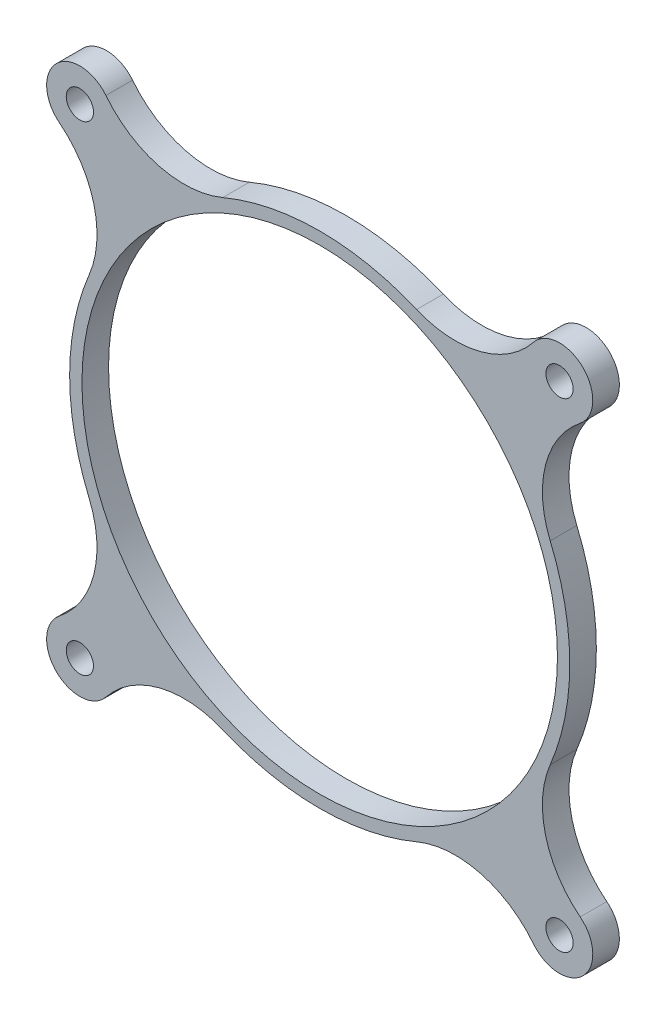
ISO-10303-21;
HEADER;
FILE_DESCRIPTION(('STEP AP214'),'2;1');
FILE_NAME('part.step','',(''),(''),'','','');
FILE_SCHEMA(('AUTOMOTIVE_DESIGN { 1 0 10303 214 1 1 1 1 }'));
ENDSEC;
DATA;
#1=APPLICATION_CONTEXT('core data for automotive mechanical design processes');
#2=APPLICATION_PROTOCOL_DEFINITION('international standard','automotive_design',2000,#1);
#3=PRODUCT_CONTEXT('',#1,'mechanical');
#4=PRODUCT('Part','Part','',(#3));
#5=PRODUCT_RELATED_PRODUCT_CATEGORY('part','',(#4));
#6=PRODUCT_DEFINITION_FORMATION('','',#4);
#7=PRODUCT_DEFINITION_CONTEXT('part definition',#1,'design');
#8=PRODUCT_DEFINITION('design','',#6,#7);
#9=PRODUCT_DEFINITION_SHAPE('','',#8);
#10=(LENGTH_UNIT() NAMED_UNIT(*) SI_UNIT(.MILLI.,.METRE.));
#11=(NAMED_UNIT(*) PLANE_ANGLE_UNIT() SI_UNIT($,.RADIAN.));
#12=(NAMED_UNIT(*) SI_UNIT($,.STERADIAN.) SOLID_ANGLE_UNIT());
#13=UNCERTAINTY_MEASURE_WITH_UNIT(LENGTH_MEASURE(1.E-05),#10,'distance_accuracy_value','');
#14=(GEOMETRIC_REPRESENTATION_CONTEXT(3) GLOBAL_UNCERTAINTY_ASSIGNED_CONTEXT((#13)) GLOBAL_UNIT_ASSIGNED_CONTEXT((#10,
#11,#12)) REPRESENTATION_CONTEXT('',''));
#15=CARTESIAN_POINT('',(0.,0.,0.));
#16=DIRECTION('',(0.,0.,1.));
#17=DIRECTION('',(1.,0.,0.));
#18=AXIS2_PLACEMENT_3D('',#15,#16,#17);
#19=CARTESIAN_POINT('',(-10.1949988567899,-24.2435970579873,4.));
#20=DIRECTION('',(0.,0.,-1.));
#21=DIRECTION('',(-1.,0.,0.));
#22=AXIS2_PLACEMENT_3D('',#19,#20,#21);
#23=PLANE('',#22);
#24=CARTESIAN_POINT('',(36.0624458405139,-36.062445840514,4.));
#25=DIRECTION('',(0.,0.,1.));
#26=DIRECTION('',(-1.,0.,0.));
#27=AXIS2_PLACEMENT_3D('',#24,#25,#26);
#28=CIRCLE('',#27,2.05);
#29=CARTESIAN_POINT('',(34.0124458405138,-36.062445840514,4.));
#30=VERTEX_POINT('',#29);
#31=EDGE_CURVE('E353',#30,#30,#28,.T.);
#32=ORIENTED_EDGE('',*,*,#31,.F.);
#33=EDGE_LOOP('',(#32));
#34=FACE_BOUND('',#33,.T.);
#35=CARTESIAN_POINT('',(36.0624458405138,36.062445840514,4.));
#36=DIRECTION('',(0.,0.,1.));
#37=DIRECTION('',(1.,0.,0.));
#38=AXIS2_PLACEMENT_3D('',#35,#36,#37);
#39=CIRCLE('',#38,2.05);
#40=CARTESIAN_POINT('',(38.1124458405138,36.062445840514,4.));
#41=VERTEX_POINT('',#40);
#42=EDGE_CURVE('E359',#41,#41,#39,.T.);
#43=ORIENTED_EDGE('',*,*,#42,.F.);
#44=EDGE_LOOP('',(#43));
#45=FACE_BOUND('',#44,.T.);
#46=CARTESIAN_POINT('',(-36.0624458405138,36.062445840514,4.));
#47=DIRECTION('',(0.,0.,1.));
#48=DIRECTION('',(-1.,0.,0.));
#49=AXIS2_PLACEMENT_3D('',#46,#47,#48);
#50=CIRCLE('',#49,2.05);
#51=CARTESIAN_POINT('',(-38.1124458405138,36.062445840514,4.));
#52=VERTEX_POINT('',#51);
#53=EDGE_CURVE('E365',#52,#52,#50,.T.);
#54=ORIENTED_EDGE('',*,*,#53,.F.);
#55=EDGE_LOOP('',(#54));
#56=FACE_BOUND('',#55,.T.);
#57=CARTESIAN_POINT('',(-36.0624458405139,-36.062445840514,4.));
#58=DIRECTION('',(0.,0.,1.));
#59=DIRECTION('',(1.,0.,0.));
#60=AXIS2_PLACEMENT_3D('',#57,#58,#59);
#61=CIRCLE('',#60,2.05);
#62=CARTESIAN_POINT('',(-34.0124458405138,-36.062445840514,4.));
#63=VERTEX_POINT('',#62);
#64=EDGE_CURVE('E189',#63,#63,#61,.T.);
#65=ORIENTED_EDGE('',*,*,#64,.F.);
#66=EDGE_LOOP('',(#65));
#67=FACE_BOUND('',#66,.T.);
#68=CARTESIAN_POINT('',(-20.3899977135799,-48.4871941159747,4.));
#69=DIRECTION('',(0.,0.,-1.));
#70=DIRECTION('',(-1.,0.,0.));
#71=AXIS2_PLACEMENT_3D('',#68,#69,#70);
#72=CIRCLE('',#71,15.);
#73=CARTESIAN_POINT('',(-32.1443338087804,-39.1686329093791,4.));
#74=VERTEX_POINT('',#73);
#75=CARTESIAN_POINT('',(-14.5753595823309,-34.6600475049553,4.));
#76=VERTEX_POINT('',#75);
#77=EDGE_CURVE('E216',#74,#76,#72,.T.);
#78=ORIENTED_EDGE('',*,*,#77,.T.);
#79=CARTESIAN_POINT('',(0.,0.,4.));
#80=DIRECTION('',(0.,0.,1.));
#81=DIRECTION('',(1.,0.,0.));
#82=AXIS2_PLACEMENT_3D('',#79,#80,#81);
#83=CIRCLE('',#82,37.6);
#84=CARTESIAN_POINT('',(14.5753595823308,-34.6600475049553,4.));
#85=VERTEX_POINT('',#84);
#86=EDGE_CURVE('E124',#76,#85,#83,.T.);
#87=ORIENTED_EDGE('',*,*,#86,.T.);
#88=CARTESIAN_POINT('',(20.3899977135799,-48.4871941159747,4.));
#89=DIRECTION('',(0.,0.,-1.));
#90=DIRECTION('',(1.,0.,0.));
#91=AXIS2_PLACEMENT_3D('',#88,#89,#90);
#92=CIRCLE('',#91,15.);
#93=CARTESIAN_POINT('',(32.1443338087804,-39.1686329093791,4.));
#94=VERTEX_POINT('',#93);
#95=EDGE_CURVE('E256',#85,#94,#92,.T.);
#96=ORIENTED_EDGE('',*,*,#95,.T.);
#97=CARTESIAN_POINT('',(36.0624458405139,-36.062445840514,4.));
#98=DIRECTION('',(0.,0.,1.));
#99=DIRECTION('',(-1.,0.,0.));
#100=AXIS2_PLACEMENT_3D('',#97,#98,#99);
#101=CIRCLE('',#100,4.99999999999999);
#102=CARTESIAN_POINT('',(39.168632909379,-32.1443338087805,4.));
#103=VERTEX_POINT('',#102);
#104=EDGE_CURVE('E275',#94,#103,#101,.T.);
#105=ORIENTED_EDGE('',*,*,#104,.T.);
#106=CARTESIAN_POINT('',(48.4871941159746,-20.38999771358,4.));
#107=DIRECTION('',(0.,0.,-1.));
#108=DIRECTION('',(-1.,0.,0.));
#109=AXIS2_PLACEMENT_3D('',#106,#107,#108);
#110=CIRCLE('',#109,15.);
#111=CARTESIAN_POINT('',(34.6600475049552,-14.575359582331,4.));
#112=VERTEX_POINT('',#111);
#113=EDGE_CURVE('E272',#103,#112,#110,.T.);
#114=ORIENTED_EDGE('',*,*,#113,.T.);
#115=CARTESIAN_POINT('',(0.,0.,4.));
#116=DIRECTION('',(0.,0.,1.));
#117=DIRECTION('',(1.,0.,0.));
#118=AXIS2_PLACEMENT_3D('',#115,#116,#117);
#119=CIRCLE('',#118,37.6);
#120=CARTESIAN_POINT('',(34.6600475049552,14.575359582331,4.));
#121=VERTEX_POINT('',#120);
#122=EDGE_CURVE('E274',#112,#121,#119,.T.);
#123=ORIENTED_EDGE('',*,*,#122,.T.);
#124=CARTESIAN_POINT('',(48.4871941159745,20.38999771358,4.));
#125=DIRECTION('',(0.,0.,-1.));
#126=DIRECTION('',(1.,0.,0.));
#127=AXIS2_PLACEMENT_3D('',#124,#125,#126);
#128=CIRCLE('',#127,15.);
#129=CARTESIAN_POINT('',(39.168632909379,32.1443338087805,4.));
#130=VERTEX_POINT('',#129);
#131=EDGE_CURVE('E277',#121,#130,#128,.T.);
#132=ORIENTED_EDGE('',*,*,#131,.T.);
#133=CARTESIAN_POINT('',(36.0624458405138,36.062445840514,4.));
#134=DIRECTION('',(0.,0.,1.));
#135=DIRECTION('',(1.,0.,0.));
#136=AXIS2_PLACEMENT_3D('',#133,#134,#135);
#137=CIRCLE('',#136,4.99999999999999);
#138=CARTESIAN_POINT('',(32.1443338087803,39.1686329093791,4.));
#139=VERTEX_POINT('',#138);
#140=EDGE_CURVE('E283',#130,#139,#137,.T.);
#141=ORIENTED_EDGE('',*,*,#140,.T.);
#142=CARTESIAN_POINT('',(20.3899977135798,48.4871941159747,4.));
#143=DIRECTION('',(0.,0.,-1.));
#144=DIRECTION('',(-1.,0.,0.));
#145=AXIS2_PLACEMENT_3D('',#142,#143,#144);
#146=CIRCLE('',#145,15.);
#147=CARTESIAN_POINT('',(14.5753595823308,34.6600475049553,4.));
#148=VERTEX_POINT('',#147);
#149=EDGE_CURVE('E285',#139,#148,#146,.T.);
#150=ORIENTED_EDGE('',*,*,#149,.T.);
#151=CARTESIAN_POINT('',(0.,0.,4.));
#152=DIRECTION('',(0.,0.,1.));
#153=DIRECTION('',(1.,0.,0.));
#154=AXIS2_PLACEMENT_3D('',#151,#152,#153);
#155=CIRCLE('',#154,37.6);
#156=CARTESIAN_POINT('',(-14.5753595823309,34.6600475049553,4.));
#157=VERTEX_POINT('',#156);
#158=EDGE_CURVE('E287',#148,#157,#155,.T.);
#159=ORIENTED_EDGE('',*,*,#158,.T.);
#160=CARTESIAN_POINT('',(-20.3899977135798,48.4871941159747,4.));
#161=DIRECTION('',(0.,0.,-1.));
#162=DIRECTION('',(1.,0.,0.));
#163=AXIS2_PLACEMENT_3D('',#160,#161,#162);
#164=CIRCLE('',#163,15.);
#165=CARTESIAN_POINT('',(-32.1443338087803,39.1686329093791,4.));
#166=VERTEX_POINT('',#165);
#167=EDGE_CURVE('E289',#157,#166,#164,.T.);
#168=ORIENTED_EDGE('',*,*,#167,.T.);
#169=CARTESIAN_POINT('',(-36.0624458405138,36.062445840514,4.));
#170=DIRECTION('',(0.,0.,1.));
#171=DIRECTION('',(-1.,0.,0.));
#172=AXIS2_PLACEMENT_3D('',#169,#170,#171);
#173=CIRCLE('',#172,4.99999999999999);
#174=CARTESIAN_POINT('',(-39.168632909379,32.1443338087805,4.));
#175=VERTEX_POINT('',#174);
#176=EDGE_CURVE('E291',#166,#175,#173,.T.);
#177=ORIENTED_EDGE('',*,*,#176,.T.);
#178=CARTESIAN_POINT('',(-48.4871941159745,20.38999771358,4.));
#179=DIRECTION('',(0.,0.,-1.));
#180=DIRECTION('',(-1.,0.,0.));
#181=AXIS2_PLACEMENT_3D('',#178,#179,#180);
#182=CIRCLE('',#181,15.);
#183=CARTESIAN_POINT('',(-34.6600475049552,14.575359582331,4.));
#184=VERTEX_POINT('',#183);
#185=EDGE_CURVE('E167',#175,#184,#182,.T.);
#186=ORIENTED_EDGE('',*,*,#185,.T.);
#187=CARTESIAN_POINT('',(0.,0.,4.));
#188=DIRECTION('',(0.,0.,1.));
#189=DIRECTION('',(1.,0.,0.));
#190=AXIS2_PLACEMENT_3D('',#187,#188,#189);
#191=CIRCLE('',#190,37.6);
#192=CARTESIAN_POINT('',(-34.6600475049552,-14.575359582331,4.));
#193=VERTEX_POINT('',#192);
#194=EDGE_CURVE('E161',#184,#193,#191,.T.);
#195=ORIENTED_EDGE('',*,*,#194,.T.);
#196=CARTESIAN_POINT('',(-48.4871941159746,-20.38999771358,4.));
#197=DIRECTION('',(0.,0.,-1.));
#198=DIRECTION('',(1.,0.,0.));
#199=AXIS2_PLACEMENT_3D('',#196,#197,#198);
#200=CIRCLE('',#199,15.);
#201=CARTESIAN_POINT('',(-39.168632909379,-32.1443338087805,4.));
#202=VERTEX_POINT('',#201);
#203=EDGE_CURVE('E165',#193,#202,#200,.T.);
#204=ORIENTED_EDGE('',*,*,#203,.T.);
#205=CARTESIAN_POINT('',(-36.0624458405139,-36.062445840514,4.));
#206=DIRECTION('',(0.,0.,1.));
#207=DIRECTION('',(1.,0.,0.));
#208=AXIS2_PLACEMENT_3D('',#205,#206,#207);
#209=CIRCLE('',#208,4.99999999999999);
#210=EDGE_CURVE('E57',#202,#74,#209,.T.);
#211=ORIENTED_EDGE('',*,*,#210,.T.);
#212=EDGE_LOOP('',(#78,#87,#96,#105,#114,#123,#132,#141,#150,#159,#168,#177,#186,#195,#204,#211));
#213=FACE_BOUND('',#212,.T.);
#214=CARTESIAN_POINT('',(0.,0.,4.));
#215=DIRECTION('',(0.,0.,-1.));
#216=DIRECTION('',(-1.,0.,0.));
#217=AXIS2_PLACEMENT_3D('',#214,#215,#216);
#218=CIRCLE('',#217,35.75);
#219=CARTESIAN_POINT('',(-35.75,0.,4.));
#220=VERTEX_POINT('',#219);
#221=EDGE_CURVE('E349',#220,#220,#218,.T.);
#222=ORIENTED_EDGE('',*,*,#221,.T.);
#223=EDGE_LOOP('',(#222));
#224=FACE_BOUND('',#223,.T.);
#225=ADVANCED_FACE('F39',(#34,#45,#56,#67,#213,#224),#23,.F.);
#226=CARTESIAN_POINT('',(-10.1949988567899,-24.2435970579873,0.));
#227=DIRECTION('',(0.,0.,-1.));
#228=DIRECTION('',(-1.,0.,0.));
#229=AXIS2_PLACEMENT_3D('',#226,#227,#228);
#230=PLANE('',#229);
#231=CARTESIAN_POINT('',(36.0624458405139,-36.062445840514,0.));
#232=DIRECTION('',(0.,0.,1.));
#233=DIRECTION('',(-1.,0.,0.));
#234=AXIS2_PLACEMENT_3D('',#231,#232,#233);
#235=CIRCLE('',#234,2.05);
#236=CARTESIAN_POINT('',(34.0124458405138,-36.062445840514,0.));
#237=VERTEX_POINT('',#236);
#238=EDGE_CURVE('E351',#237,#237,#235,.T.);
#239=ORIENTED_EDGE('',*,*,#238,.T.);
#240=EDGE_LOOP('',(#239));
#241=FACE_BOUND('',#240,.T.);
#242=CARTESIAN_POINT('',(-36.0624458405138,36.062445840514,0.));
#243=DIRECTION('',(0.,0.,1.));
#244=DIRECTION('',(-1.,0.,0.));
#245=AXIS2_PLACEMENT_3D('',#242,#243,#244);
#246=CIRCLE('',#245,2.05);
#247=CARTESIAN_POINT('',(-38.1124458405138,36.062445840514,0.));
#248=VERTEX_POINT('',#247);
#249=EDGE_CURVE('E362',#248,#248,#246,.T.);
#250=ORIENTED_EDGE('',*,*,#249,.T.);
#251=EDGE_LOOP('',(#250));
#252=FACE_BOUND('',#251,.T.);
#253=CARTESIAN_POINT('',(-36.0624458405139,-36.062445840514,0.));
#254=DIRECTION('',(0.,0.,1.));
#255=DIRECTION('',(1.,0.,0.));
#256=AXIS2_PLACEMENT_3D('',#253,#254,#255);
#257=CIRCLE('',#256,2.05);
#258=CARTESIAN_POINT('',(-34.0124458405138,-36.062445840514,0.));
#259=VERTEX_POINT('',#258);
#260=EDGE_CURVE('E368',#259,#259,#257,.T.);
#261=ORIENTED_EDGE('',*,*,#260,.T.);
#262=EDGE_LOOP('',(#261));
#263=FACE_BOUND('',#262,.T.);
#264=CARTESIAN_POINT('',(-20.3899977135799,-48.4871941159747,0.));
#265=DIRECTION('',(0.,0.,-1.));
#266=DIRECTION('',(-1.,0.,0.));
#267=AXIS2_PLACEMENT_3D('',#264,#265,#266);
#268=CIRCLE('',#267,15.);
#269=CARTESIAN_POINT('',(-32.1443338087804,-39.1686329093791,0.));
#270=VERTEX_POINT('',#269);
#271=CARTESIAN_POINT('',(-14.5753595823309,-34.6600475049553,0.));
#272=VERTEX_POINT('',#271);
#273=EDGE_CURVE('E185',#270,#272,#268,.T.);
#274=ORIENTED_EDGE('',*,*,#273,.F.);
#275=CARTESIAN_POINT('',(-36.0624458405139,-36.062445840514,0.));
#276=DIRECTION('',(0.,0.,1.));
#277=DIRECTION('',(1.,0.,0.));
#278=AXIS2_PLACEMENT_3D('',#275,#276,#277);
#279=CIRCLE('',#278,4.99999999999999);
#280=CARTESIAN_POINT('',(-39.168632909379,-32.1443338087805,0.));
#281=VERTEX_POINT('',#280);
#282=EDGE_CURVE('E116',#281,#270,#279,.T.);
#283=ORIENTED_EDGE('',*,*,#282,.F.);
#284=CARTESIAN_POINT('',(-48.4871941159746,-20.38999771358,0.));
#285=DIRECTION('',(0.,0.,-1.));
#286=DIRECTION('',(1.,0.,0.));
#287=AXIS2_PLACEMENT_3D('',#284,#285,#286);
#288=CIRCLE('',#287,15.);
#289=CARTESIAN_POINT('',(-34.6600475049552,-14.575359582331,0.));
#290=VERTEX_POINT('',#289);
#291=EDGE_CURVE('E110',#290,#281,#288,.T.);
#292=ORIENTED_EDGE('',*,*,#291,.F.);
#293=CARTESIAN_POINT('',(0.,0.,0.));
#294=DIRECTION('',(0.,0.,1.));
#295=DIRECTION('',(1.,0.,0.));
#296=AXIS2_PLACEMENT_3D('',#293,#294,#295);
#297=CIRCLE('',#296,37.6);
#298=CARTESIAN_POINT('',(-34.6600475049552,14.575359582331,0.));
#299=VERTEX_POINT('',#298);
#300=EDGE_CURVE('E175',#299,#290,#297,.T.);
#301=ORIENTED_EDGE('',*,*,#300,.F.);
#302=CARTESIAN_POINT('',(-48.4871941159745,20.38999771358,0.));
#303=DIRECTION('',(0.,0.,-1.));
#304=DIRECTION('',(-1.,0.,0.));
#305=AXIS2_PLACEMENT_3D('',#302,#303,#304);
#306=CIRCLE('',#305,15.);
#307=CARTESIAN_POINT('',(-39.168632909379,32.1443338087805,0.));
#308=VERTEX_POINT('',#307);
#309=EDGE_CURVE('E211',#308,#299,#306,.T.);
#310=ORIENTED_EDGE('',*,*,#309,.F.);
#311=CARTESIAN_POINT('',(-36.0624458405138,36.062445840514,0.));
#312=DIRECTION('',(0.,0.,1.));
#313=DIRECTION('',(-1.,0.,0.));
#314=AXIS2_PLACEMENT_3D('',#311,#312,#313);
#315=CIRCLE('',#314,4.99999999999999);
#316=CARTESIAN_POINT('',(-32.1443338087803,39.1686329093791,0.));
#317=VERTEX_POINT('',#316);
#318=EDGE_CURVE('E209',#317,#308,#315,.T.);
#319=ORIENTED_EDGE('',*,*,#318,.F.);
#320=CARTESIAN_POINT('',(-20.3899977135798,48.4871941159747,0.));
#321=DIRECTION('',(0.,0.,-1.));
#322=DIRECTION('',(1.,0.,0.));
#323=AXIS2_PLACEMENT_3D('',#320,#321,#322);
#324=CIRCLE('',#323,15.);
#325=CARTESIAN_POINT('',(-14.5753595823309,34.6600475049553,0.));
#326=VERTEX_POINT('',#325);
#327=EDGE_CURVE('E207',#326,#317,#324,.T.);
#328=ORIENTED_EDGE('',*,*,#327,.F.);
#329=CARTESIAN_POINT('',(0.,0.,0.));
#330=DIRECTION('',(0.,0.,1.));
#331=DIRECTION('',(1.,0.,0.));
#332=AXIS2_PLACEMENT_3D('',#329,#330,#331);
#333=CIRCLE('',#332,37.6);
#334=CARTESIAN_POINT('',(14.5753595823308,34.6600475049553,0.));
#335=VERTEX_POINT('',#334);
#336=EDGE_CURVE('E205',#335,#326,#333,.T.);
#337=ORIENTED_EDGE('',*,*,#336,.F.);
#338=CARTESIAN_POINT('',(20.3899977135798,48.4871941159747,0.));
#339=DIRECTION('',(0.,0.,-1.));
#340=DIRECTION('',(-1.,0.,0.));
#341=AXIS2_PLACEMENT_3D('',#338,#339,#340);
#342=CIRCLE('',#341,15.);
#343=CARTESIAN_POINT('',(32.1443338087803,39.1686329093791,0.));
#344=VERTEX_POINT('',#343);
#345=EDGE_CURVE('E203',#344,#335,#342,.T.);
#346=ORIENTED_EDGE('',*,*,#345,.F.);
#347=CARTESIAN_POINT('',(36.0624458405138,36.062445840514,0.));
#348=DIRECTION('',(0.,0.,1.));
#349=DIRECTION('',(1.,0.,0.));
#350=AXIS2_PLACEMENT_3D('',#347,#348,#349);
#351=CIRCLE('',#350,4.99999999999999);
#352=CARTESIAN_POINT('',(39.168632909379,32.1443338087805,0.));
#353=VERTEX_POINT('',#352);
#354=EDGE_CURVE('E201',#353,#344,#351,.T.);
#355=ORIENTED_EDGE('',*,*,#354,.F.);
#356=CARTESIAN_POINT('',(48.4871941159745,20.38999771358,0.));
#357=DIRECTION('',(0.,0.,-1.));
#358=DIRECTION('',(1.,0.,0.));
#359=AXIS2_PLACEMENT_3D('',#356,#357,#358);
#360=CIRCLE('',#359,15.);
#361=CARTESIAN_POINT('',(34.6600475049552,14.575359582331,0.));
#362=VERTEX_POINT('',#361);
#363=EDGE_CURVE('E199',#362,#353,#360,.T.);
#364=ORIENTED_EDGE('',*,*,#363,.F.);
#365=CARTESIAN_POINT('',(0.,0.,0.));
#366=DIRECTION('',(0.,0.,1.));
#367=DIRECTION('',(1.,0.,0.));
#368=AXIS2_PLACEMENT_3D('',#365,#366,#367);
#369=CIRCLE('',#368,37.6);
#370=CARTESIAN_POINT('',(34.6600475049552,-14.575359582331,0.));
#371=VERTEX_POINT('',#370);
#372=EDGE_CURVE('E197',#371,#362,#369,.T.);
#373=ORIENTED_EDGE('',*,*,#372,.F.);
#374=CARTESIAN_POINT('',(48.4871941159746,-20.38999771358,0.));
#375=DIRECTION('',(0.,0.,-1.));
#376=DIRECTION('',(-1.,0.,0.));
#377=AXIS2_PLACEMENT_3D('',#374,#375,#376);
#378=CIRCLE('',#377,15.);
#379=CARTESIAN_POINT('',(39.168632909379,-32.1443338087805,0.));
#380=VERTEX_POINT('',#379);
#381=EDGE_CURVE('E195',#380,#371,#378,.T.);
#382=ORIENTED_EDGE('',*,*,#381,.F.);
#383=CARTESIAN_POINT('',(36.0624458405139,-36.062445840514,0.));
#384=DIRECTION('',(0.,0.,1.));
#385=DIRECTION('',(-1.,0.,0.));
#386=AXIS2_PLACEMENT_3D('',#383,#384,#385);
#387=CIRCLE('',#386,4.99999999999999);
#388=CARTESIAN_POINT('',(32.1443338087804,-39.1686329093791,0.));
#389=VERTEX_POINT('',#388);
#390=EDGE_CURVE('E193',#389,#380,#387,.T.);
#391=ORIENTED_EDGE('',*,*,#390,.F.);
#392=CARTESIAN_POINT('',(20.3899977135799,-48.4871941159747,0.));
#393=DIRECTION('',(0.,0.,-1.));
#394=DIRECTION('',(1.,0.,0.));
#395=AXIS2_PLACEMENT_3D('',#392,#393,#394);
#396=CIRCLE('',#395,15.);
#397=CARTESIAN_POINT('',(14.5753595823308,-34.6600475049553,0.));
#398=VERTEX_POINT('',#397);
#399=EDGE_CURVE('E191',#398,#389,#396,.T.);
#400=ORIENTED_EDGE('',*,*,#399,.F.);
#401=CARTESIAN_POINT('',(0.,0.,0.));
#402=DIRECTION('',(0.,0.,1.));
#403=DIRECTION('',(1.,0.,0.));
#404=AXIS2_PLACEMENT_3D('',#401,#402,#403);
#405=CIRCLE('',#404,37.6);
#406=EDGE_CURVE('E188',#272,#398,#405,.T.);
#407=ORIENTED_EDGE('',*,*,#406,.F.);
#408=EDGE_LOOP('',(#274,#283,#292,#301,#310,#319,#328,#337,#346,#355,#364,#373,#382,#391,#400,#407));
#409=FACE_BOUND('',#408,.T.);
#410=CARTESIAN_POINT('',(36.0624458405138,36.062445840514,0.));
#411=DIRECTION('',(0.,0.,1.));
#412=DIRECTION('',(1.,0.,0.));
#413=AXIS2_PLACEMENT_3D('',#410,#411,#412);
#414=CIRCLE('',#413,2.05);
#415=CARTESIAN_POINT('',(38.1124458405138,36.062445840514,0.));
#416=VERTEX_POINT('',#415);
#417=EDGE_CURVE('E356',#416,#416,#414,.T.);
#418=ORIENTED_EDGE('',*,*,#417,.T.);
#419=EDGE_LOOP('',(#418));
#420=FACE_BOUND('',#419,.T.);
#421=CARTESIAN_POINT('',(0.,0.,0.));
#422=DIRECTION('',(0.,0.,-1.));
#423=DIRECTION('',(-1.,0.,0.));
#424=AXIS2_PLACEMENT_3D('',#421,#422,#423);
#425=CIRCLE('',#424,35.75);
#426=CARTESIAN_POINT('',(-35.75,0.,0.));
#427=VERTEX_POINT('',#426);
#428=EDGE_CURVE('E43',#427,#427,#425,.F.);
#429=ORIENTED_EDGE('',*,*,#428,.T.);
#430=EDGE_LOOP('',(#429));
#431=FACE_BOUND('',#430,.T.);
#432=ADVANCED_FACE('F260',(#241,#252,#263,#409,#420,#431),#230,.T.);
#433=CARTESIAN_POINT('',(-20.3899977135799,-48.4871941159747,4.));
#434=DIRECTION('',(0.,0.,-1.));
#435=DIRECTION('',(-1.,0.,0.));
#436=AXIS2_PLACEMENT_3D('',#433,#434,#435);
#437=CYLINDRICAL_SURFACE('',#436,15.);
#438=ORIENTED_EDGE('',*,*,#273,.T.);
#439=DIRECTION('',(0.,0.,-1.));
#440=VECTOR('',#439,1.);
#441=CARTESIAN_POINT('',(-14.5753595823309,-34.6600475049553,4.));
#442=LINE('',#441,#440);
#443=EDGE_CURVE('E11',#76,#272,#442,.T.);
#444=ORIENTED_EDGE('',*,*,#443,.F.);
#445=ORIENTED_EDGE('',*,*,#77,.F.);
#446=DIRECTION('',(0.,0.,-1.));
#447=VECTOR('',#446,1.);
#448=CARTESIAN_POINT('',(-32.1443338087804,-39.1686329093791,4.));
#449=LINE('',#448,#447);
#450=EDGE_CURVE('E181',#74,#270,#449,.T.);
#451=ORIENTED_EDGE('',*,*,#450,.T.);
#452=EDGE_LOOP('',(#438,#444,#445,#451));
#453=FACE_BOUND('',#452,.T.);
#454=ADVANCED_FACE('F41',(#453),#437,.F.);
#455=CARTESIAN_POINT('',(0.,0.,4.));
#456=DIRECTION('',(0.,0.,-1.));
#457=DIRECTION('',(-1.,0.,0.));
#458=AXIS2_PLACEMENT_3D('',#455,#456,#457);
#459=CYLINDRICAL_SURFACE('',#458,37.6);
#460=ORIENTED_EDGE('',*,*,#406,.T.);
#461=DIRECTION('',(0.,0.,-1.));
#462=VECTOR('',#461,1.);
#463=CARTESIAN_POINT('',(14.5753595823308,-34.6600475049553,4.));
#464=LINE('',#463,#462);
#465=EDGE_CURVE('E49',#85,#398,#464,.T.);
#466=ORIENTED_EDGE('',*,*,#465,.F.);
#467=ORIENTED_EDGE('',*,*,#86,.F.);
#468=ORIENTED_EDGE('',*,*,#443,.T.);
#469=EDGE_LOOP('',(#460,#466,#467,#468));
#470=FACE_BOUND('',#469,.T.);
#471=ADVANCED_FACE('F529',(#470),#459,.T.);
#472=CARTESIAN_POINT('',(20.3899977135799,-48.4871941159747,4.));
#473=DIRECTION('',(0.,0.,-1.));
#474=DIRECTION('',(-1.,0.,0.));
#475=AXIS2_PLACEMENT_3D('',#472,#473,#474);
#476=CYLINDRICAL_SURFACE('',#475,15.);
#477=ORIENTED_EDGE('',*,*,#399,.T.);
#478=DIRECTION('',(0.,0.,-1.));
#479=VECTOR('',#478,1.);
#480=CARTESIAN_POINT('',(32.1443338087804,-39.1686329093791,4.));
#481=LINE('',#480,#479);
#482=EDGE_CURVE('E247',#94,#389,#481,.T.);
#483=ORIENTED_EDGE('',*,*,#482,.F.);
#484=ORIENTED_EDGE('',*,*,#95,.F.);
#485=ORIENTED_EDGE('',*,*,#465,.T.);
#486=EDGE_LOOP('',(#477,#483,#484,#485));
#487=FACE_BOUND('',#486,.T.);
#488=ADVANCED_FACE('F254',(#487),#476,.F.);
#489=CARTESIAN_POINT('',(36.0624458405139,-36.062445840514,4.));
#490=DIRECTION('',(0.,0.,-1.));
#491=DIRECTION('',(-1.,0.,0.));
#492=AXIS2_PLACEMENT_3D('',#489,#490,#491);
#493=CYLINDRICAL_SURFACE('',#492,4.99999999999999);
#494=ORIENTED_EDGE('',*,*,#390,.T.);
#495=DIRECTION('',(0.,0.,-1.));
#496=VECTOR('',#495,1.);
#497=CARTESIAN_POINT('',(39.168632909379,-32.1443338087805,4.));
#498=LINE('',#497,#496);
#499=EDGE_CURVE('E244',#103,#380,#498,.T.);
#500=ORIENTED_EDGE('',*,*,#499,.F.);
#501=ORIENTED_EDGE('',*,*,#104,.F.);
#502=ORIENTED_EDGE('',*,*,#482,.T.);
#503=EDGE_LOOP('',(#494,#500,#501,#502));
#504=FACE_BOUND('',#503,.T.);
#505=ADVANCED_FACE('F266',(#504),#493,.T.);
#506=CARTESIAN_POINT('',(48.4871941159746,-20.38999771358,4.));
#507=DIRECTION('',(0.,0.,-1.));
#508=DIRECTION('',(-1.,0.,0.));
#509=AXIS2_PLACEMENT_3D('',#506,#507,#508);
#510=CYLINDRICAL_SURFACE('',#509,15.);
#511=ORIENTED_EDGE('',*,*,#381,.T.);
#512=DIRECTION('',(0.,0.,-1.));
#513=VECTOR('',#512,1.);
#514=CARTESIAN_POINT('',(34.6600475049552,-14.575359582331,4.));
#515=LINE('',#514,#513);
#516=EDGE_CURVE('E241',#112,#371,#515,.T.);
#517=ORIENTED_EDGE('',*,*,#516,.F.);
#518=ORIENTED_EDGE('',*,*,#113,.F.);
#519=ORIENTED_EDGE('',*,*,#499,.T.);
#520=EDGE_LOOP('',(#511,#517,#518,#519));
#521=FACE_BOUND('',#520,.T.);
#522=ADVANCED_FACE('F270',(#521),#510,.F.);
#523=CARTESIAN_POINT('',(0.,0.,4.));
#524=DIRECTION('',(0.,0.,-1.));
#525=DIRECTION('',(-1.,0.,0.));
#526=AXIS2_PLACEMENT_3D('',#523,#524,#525);
#527=CYLINDRICAL_SURFACE('',#526,37.6);
#528=ORIENTED_EDGE('',*,*,#372,.T.);
#529=DIRECTION('',(0.,0.,-1.));
#530=VECTOR('',#529,1.);
#531=CARTESIAN_POINT('',(34.6600475049552,14.575359582331,4.));
#532=LINE('',#531,#530);
#533=EDGE_CURVE('E238',#121,#362,#532,.T.);
#534=ORIENTED_EDGE('',*,*,#533,.F.);
#535=ORIENTED_EDGE('',*,*,#122,.F.);
#536=ORIENTED_EDGE('',*,*,#516,.T.);
#537=EDGE_LOOP('',(#528,#534,#535,#536));
#538=FACE_BOUND('',#537,.T.);
#539=ADVANCED_FACE('F498',(#538),#527,.T.);
#540=CARTESIAN_POINT('',(48.4871941159745,20.38999771358,4.));
#541=DIRECTION('',(0.,0.,-1.));
#542=DIRECTION('',(-1.,0.,0.));
#543=AXIS2_PLACEMENT_3D('',#540,#541,#542);
#544=CYLINDRICAL_SURFACE('',#543,15.);
#545=ORIENTED_EDGE('',*,*,#363,.T.);
#546=DIRECTION('',(0.,0.,-1.));
#547=VECTOR('',#546,1.);
#548=CARTESIAN_POINT('',(39.168632909379,32.1443338087805,4.));
#549=LINE('',#548,#547);
#550=EDGE_CURVE('E235',#130,#353,#549,.T.);
#551=ORIENTED_EDGE('',*,*,#550,.F.);
#552=ORIENTED_EDGE('',*,*,#131,.F.);
#553=ORIENTED_EDGE('',*,*,#533,.T.);
#554=EDGE_LOOP('',(#545,#551,#552,#553));
#555=FACE_BOUND('',#554,.T.);
#556=ADVANCED_FACE('F489',(#555),#544,.F.);
#557=CARTESIAN_POINT('',(36.0624458405138,36.062445840514,4.));
#558=DIRECTION('',(0.,0.,-1.));
#559=DIRECTION('',(-1.,0.,0.));
#560=AXIS2_PLACEMENT_3D('',#557,#558,#559);
#561=CYLINDRICAL_SURFACE('',#560,4.99999999999999);
#562=ORIENTED_EDGE('',*,*,#354,.T.);
#563=DIRECTION('',(0.,0.,-1.));
#564=VECTOR('',#563,1.);
#565=CARTESIAN_POINT('',(32.1443338087803,39.1686329093791,4.));
#566=LINE('',#565,#564);
#567=EDGE_CURVE('E232',#139,#344,#566,.T.);
#568=ORIENTED_EDGE('',*,*,#567,.F.);
#569=ORIENTED_EDGE('',*,*,#140,.F.);
#570=ORIENTED_EDGE('',*,*,#550,.T.);
#571=EDGE_LOOP('',(#562,#568,#569,#570));
#572=FACE_BOUND('',#571,.T.);
#573=ADVANCED_FACE('F480',(#572),#561,.T.);
#574=CARTESIAN_POINT('',(20.3899977135798,48.4871941159747,4.));
#575=DIRECTION('',(0.,0.,-1.));
#576=DIRECTION('',(-1.,0.,0.));
#577=AXIS2_PLACEMENT_3D('',#574,#575,#576);
#578=CYLINDRICAL_SURFACE('',#577,15.);
#579=ORIENTED_EDGE('',*,*,#345,.T.);
#580=DIRECTION('',(0.,0.,-1.));
#581=VECTOR('',#580,1.);
#582=CARTESIAN_POINT('',(14.5753595823308,34.6600475049553,4.));
#583=LINE('',#582,#581);
#584=EDGE_CURVE('E229',#148,#335,#583,.T.);
#585=ORIENTED_EDGE('',*,*,#584,.F.);
#586=ORIENTED_EDGE('',*,*,#149,.F.);
#587=ORIENTED_EDGE('',*,*,#567,.T.);
#588=EDGE_LOOP('',(#579,#585,#586,#587));
#589=FACE_BOUND('',#588,.T.);
#590=ADVANCED_FACE('F471',(#589),#578,.F.);
#591=CARTESIAN_POINT('',(0.,0.,4.));
#592=DIRECTION('',(0.,0.,-1.));
#593=DIRECTION('',(-1.,0.,0.));
#594=AXIS2_PLACEMENT_3D('',#591,#592,#593);
#595=CYLINDRICAL_SURFACE('',#594,37.6);
#596=ORIENTED_EDGE('',*,*,#336,.T.);
#597=DIRECTION('',(0.,0.,-1.));
#598=VECTOR('',#597,1.);
#599=CARTESIAN_POINT('',(-14.5753595823309,34.6600475049553,4.));
#600=LINE('',#599,#598);
#601=EDGE_CURVE('E226',#157,#326,#600,.T.);
#602=ORIENTED_EDGE('',*,*,#601,.F.);
#603=ORIENTED_EDGE('',*,*,#158,.F.);
#604=ORIENTED_EDGE('',*,*,#584,.T.);
#605=EDGE_LOOP('',(#596,#602,#603,#604));
#606=FACE_BOUND('',#605,.T.);
#607=ADVANCED_FACE('F462',(#606),#595,.T.);
#608=CARTESIAN_POINT('',(-20.3899977135798,48.4871941159747,4.));
#609=DIRECTION('',(0.,0.,-1.));
#610=DIRECTION('',(-1.,0.,0.));
#611=AXIS2_PLACEMENT_3D('',#608,#609,#610);
#612=CYLINDRICAL_SURFACE('',#611,15.);
#613=ORIENTED_EDGE('',*,*,#327,.T.);
#614=DIRECTION('',(0.,0.,-1.));
#615=VECTOR('',#614,1.);
#616=CARTESIAN_POINT('',(-32.1443338087803,39.1686329093791,4.));
#617=LINE('',#616,#615);
#618=EDGE_CURVE('E223',#166,#317,#617,.T.);
#619=ORIENTED_EDGE('',*,*,#618,.F.);
#620=ORIENTED_EDGE('',*,*,#167,.F.);
#621=ORIENTED_EDGE('',*,*,#601,.T.);
#622=EDGE_LOOP('',(#613,#619,#620,#621));
#623=FACE_BOUND('',#622,.T.);
#624=ADVANCED_FACE('F454',(#623),#612,.F.);
#625=CARTESIAN_POINT('',(-36.0624458405138,36.062445840514,4.));
#626=DIRECTION('',(0.,0.,-1.));
#627=DIRECTION('',(-1.,0.,0.));
#628=AXIS2_PLACEMENT_3D('',#625,#626,#627);
#629=CYLINDRICAL_SURFACE('',#628,4.99999999999999);
#630=ORIENTED_EDGE('',*,*,#318,.T.);
#631=DIRECTION('',(0.,0.,-1.));
#632=VECTOR('',#631,1.);
#633=CARTESIAN_POINT('',(-39.168632909379,32.1443338087805,4.));
#634=LINE('',#633,#632);
#635=EDGE_CURVE('E220',#175,#308,#634,.T.);
#636=ORIENTED_EDGE('',*,*,#635,.F.);
#637=ORIENTED_EDGE('',*,*,#176,.F.);
#638=ORIENTED_EDGE('',*,*,#618,.T.);
#639=EDGE_LOOP('',(#630,#636,#637,#638));
#640=FACE_BOUND('',#639,.T.);
#641=ADVANCED_FACE('F297',(#640),#629,.T.);
#642=CARTESIAN_POINT('',(-48.4871941159745,20.38999771358,4.));
#643=DIRECTION('',(0.,0.,-1.));
#644=DIRECTION('',(-1.,0.,0.));
#645=AXIS2_PLACEMENT_3D('',#642,#643,#644);
#646=CYLINDRICAL_SURFACE('',#645,15.);
#647=ORIENTED_EDGE('',*,*,#309,.T.);
#648=DIRECTION('',(0.,0.,-1.));
#649=VECTOR('',#648,1.);
#650=CARTESIAN_POINT('',(-34.6600475049552,14.575359582331,4.));
#651=LINE('',#650,#649);
#652=EDGE_CURVE('E176',#184,#299,#651,.T.);
#653=ORIENTED_EDGE('',*,*,#652,.F.);
#654=ORIENTED_EDGE('',*,*,#185,.F.);
#655=ORIENTED_EDGE('',*,*,#635,.T.);
#656=EDGE_LOOP('',(#647,#653,#654,#655));
#657=FACE_BOUND('',#656,.T.);
#658=ADVANCED_FACE('F301',(#657),#646,.F.);
#659=CARTESIAN_POINT('',(0.,0.,4.));
#660=DIRECTION('',(0.,0.,-1.));
#661=DIRECTION('',(-1.,0.,0.));
#662=AXIS2_PLACEMENT_3D('',#659,#660,#661);
#663=CYLINDRICAL_SURFACE('',#662,37.6);
#664=ORIENTED_EDGE('',*,*,#300,.T.);
#665=DIRECTION('',(0.,0.,-1.));
#666=VECTOR('',#665,1.);
#667=CARTESIAN_POINT('',(-34.6600475049552,-14.575359582331,4.));
#668=LINE('',#667,#666);
#669=EDGE_CURVE('E172',#193,#290,#668,.T.);
#670=ORIENTED_EDGE('',*,*,#669,.F.);
#671=ORIENTED_EDGE('',*,*,#194,.F.);
#672=ORIENTED_EDGE('',*,*,#652,.T.);
#673=EDGE_LOOP('',(#664,#670,#671,#672));
#674=FACE_BOUND('',#673,.T.);
#675=ADVANCED_FACE('F173',(#674),#663,.T.);
#676=CARTESIAN_POINT('',(-48.4871941159746,-20.38999771358,4.));
#677=DIRECTION('',(0.,0.,-1.));
#678=DIRECTION('',(-1.,0.,0.));
#679=AXIS2_PLACEMENT_3D('',#676,#677,#678);
#680=CYLINDRICAL_SURFACE('',#679,15.);
#681=ORIENTED_EDGE('',*,*,#291,.T.);
#682=DIRECTION('',(0.,0.,-1.));
#683=VECTOR('',#682,1.);
#684=CARTESIAN_POINT('',(-39.168632909379,-32.1443338087805,4.));
#685=LINE('',#684,#683);
#686=EDGE_CURVE('E177',#202,#281,#685,.T.);
#687=ORIENTED_EDGE('',*,*,#686,.F.);
#688=ORIENTED_EDGE('',*,*,#203,.F.);
#689=ORIENTED_EDGE('',*,*,#669,.T.);
#690=EDGE_LOOP('',(#681,#687,#688,#689));
#691=FACE_BOUND('',#690,.T.);
#692=ADVANCED_FACE('F179',(#691),#680,.F.);
#693=CARTESIAN_POINT('',(-36.0624458405139,-36.062445840514,4.));
#694=DIRECTION('',(0.,0.,-1.));
#695=DIRECTION('',(-1.,0.,0.));
#696=AXIS2_PLACEMENT_3D('',#693,#694,#695);
#697=CYLINDRICAL_SURFACE('',#696,4.99999999999999);
#698=ORIENTED_EDGE('',*,*,#282,.T.);
#699=ORIENTED_EDGE('',*,*,#450,.F.);
#700=ORIENTED_EDGE('',*,*,#210,.F.);
#701=ORIENTED_EDGE('',*,*,#686,.T.);
#702=EDGE_LOOP('',(#698,#699,#700,#701));
#703=FACE_BOUND('',#702,.T.);
#704=ADVANCED_FACE('F305',(#703),#697,.T.);
#705=CARTESIAN_POINT('',(-36.0624458405139,-36.062445840514,4.));
#706=DIRECTION('',(0.,0.,-1.));
#707=DIRECTION('',(-1.,0.,0.));
#708=AXIS2_PLACEMENT_3D('',#705,#706,#707);
#709=CYLINDRICAL_SURFACE('',#708,2.05);
#710=ORIENTED_EDGE('',*,*,#64,.T.);
#711=EDGE_LOOP('',(#710));
#712=FACE_BOUND('',#711,.T.);
#713=ORIENTED_EDGE('',*,*,#260,.F.);
#714=EDGE_LOOP('',(#713));
#715=FACE_BOUND('',#714,.T.);
#716=ADVANCED_FACE('F307',(#712,#715),#709,.F.);
#717=CARTESIAN_POINT('',(-36.0624458405138,36.062445840514,4.));
#718=DIRECTION('',(0.,0.,-1.));
#719=DIRECTION('',(-1.,0.,0.));
#720=AXIS2_PLACEMENT_3D('',#717,#718,#719);
#721=CYLINDRICAL_SURFACE('',#720,2.05);
#722=ORIENTED_EDGE('',*,*,#53,.T.);
#723=EDGE_LOOP('',(#722));
#724=FACE_BOUND('',#723,.T.);
#725=ORIENTED_EDGE('',*,*,#249,.F.);
#726=EDGE_LOOP('',(#725));
#727=FACE_BOUND('',#726,.T.);
#728=ADVANCED_FACE('F313',(#724,#727),#721,.F.);
#729=CARTESIAN_POINT('',(36.0624458405138,36.062445840514,4.));
#730=DIRECTION('',(0.,0.,-1.));
#731=DIRECTION('',(-1.,0.,0.));
#732=AXIS2_PLACEMENT_3D('',#729,#730,#731);
#733=CYLINDRICAL_SURFACE('',#732,2.05);
#734=ORIENTED_EDGE('',*,*,#42,.T.);
#735=EDGE_LOOP('',(#734));
#736=FACE_BOUND('',#735,.T.);
#737=ORIENTED_EDGE('',*,*,#417,.F.);
#738=EDGE_LOOP('',(#737));
#739=FACE_BOUND('',#738,.T.);
#740=ADVANCED_FACE('F331',(#736,#739),#733,.F.);
#741=CARTESIAN_POINT('',(36.0624458405139,-36.062445840514,4.));
#742=DIRECTION('',(0.,0.,-1.));
#743=DIRECTION('',(-1.,0.,0.));
#744=AXIS2_PLACEMENT_3D('',#741,#742,#743);
#745=CYLINDRICAL_SURFACE('',#744,2.05);
#746=ORIENTED_EDGE('',*,*,#31,.T.);
#747=EDGE_LOOP('',(#746));
#748=FACE_BOUND('',#747,.T.);
#749=ORIENTED_EDGE('',*,*,#238,.F.);
#750=EDGE_LOOP('',(#749));
#751=FACE_BOUND('',#750,.T.);
#752=ADVANCED_FACE('F335',(#748,#751),#745,.F.);
#753=CARTESIAN_POINT('',(0.,0.,-6.));
#754=DIRECTION('',(0.,0.,1.));
#755=DIRECTION('',(1.,0.,0.));
#756=AXIS2_PLACEMENT_3D('',#753,#754,#755);
#757=CYLINDRICAL_SURFACE('',#756,35.75);
#758=ORIENTED_EDGE('',*,*,#428,.F.);
#759=EDGE_LOOP('',(#758));
#760=FACE_BOUND('',#759,.T.);
#761=ORIENTED_EDGE('',*,*,#221,.F.);
#762=EDGE_LOOP('',(#761));
#763=FACE_BOUND('',#762,.T.);
#764=ADVANCED_FACE('F338',(#760,#763),#757,.F.);
#765=CLOSED_SHELL('',(#225,#432,#454,#471,#488,#505,#522,#539,#556,#573,#590,#607,#624,#641,
#658,#675,#692,#704,#716,#728,#740,#752,#764));
#766=MANIFOLD_SOLID_BREP('B2',#765);
#767=ADVANCED_BREP_SHAPE_REPRESENTATION('',(#18,#766),#14);
#768=SHAPE_DEFINITION_REPRESENTATION(#9,#767);
ENDSEC;
END-ISO-10303-21;
